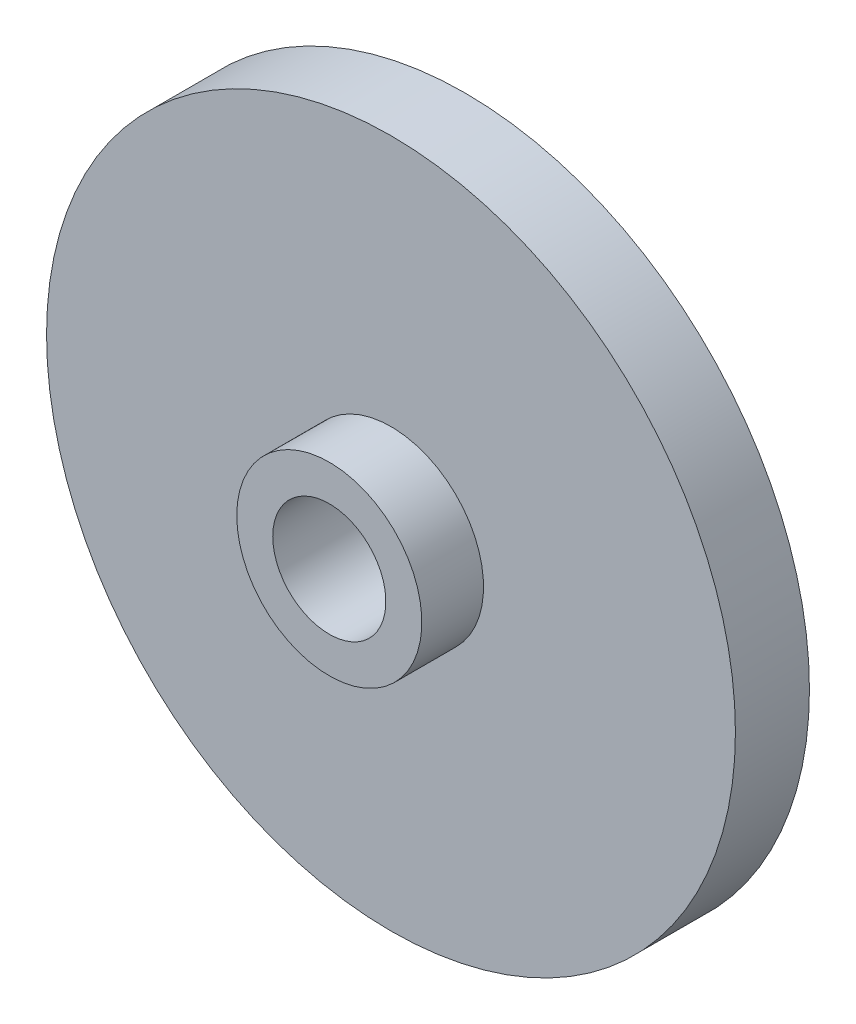
ISO-10303-21;
HEADER;
FILE_DESCRIPTION(('STEP AP214'),'2;1');
FILE_NAME('part.step','',(''),(''),'','','');
FILE_SCHEMA(('AUTOMOTIVE_DESIGN { 1 0 10303 214 1 1 1 1 }'));
ENDSEC;
DATA;
#1=APPLICATION_CONTEXT('core data for automotive mechanical design processes');
#2=APPLICATION_PROTOCOL_DEFINITION('international standard','automotive_design',2000,#1);
#3=PRODUCT_CONTEXT('',#1,'mechanical');
#4=PRODUCT('Part','Part','',(#3));
#5=PRODUCT_RELATED_PRODUCT_CATEGORY('part','',(#4));
#6=PRODUCT_DEFINITION_FORMATION('','',#4);
#7=PRODUCT_DEFINITION_CONTEXT('part definition',#1,'design');
#8=PRODUCT_DEFINITION('design','',#6,#7);
#9=PRODUCT_DEFINITION_SHAPE('','',#8);
#10=(LENGTH_UNIT() NAMED_UNIT(*) SI_UNIT(.MILLI.,.METRE.));
#11=(NAMED_UNIT(*) PLANE_ANGLE_UNIT() SI_UNIT($,.RADIAN.));
#12=(NAMED_UNIT(*) SI_UNIT($,.STERADIAN.) SOLID_ANGLE_UNIT());
#13=UNCERTAINTY_MEASURE_WITH_UNIT(LENGTH_MEASURE(1.E-05),#10,'distance_accuracy_value','');
#14=(GEOMETRIC_REPRESENTATION_CONTEXT(3) GLOBAL_UNCERTAINTY_ASSIGNED_CONTEXT((#13)) GLOBAL_UNIT_ASSIGNED_CONTEXT((#10,
#11,#12)) REPRESENTATION_CONTEXT('',''));
#15=CARTESIAN_POINT('',(0.,0.,0.));
#16=DIRECTION('',(0.,0.,1.));
#17=DIRECTION('',(1.,0.,0.));
#18=AXIS2_PLACEMENT_3D('',#15,#16,#17);
#19=CARTESIAN_POINT('',(0.,0.,6.6));
#20=DIRECTION('',(0.,0.,-1.));
#21=DIRECTION('',(-1.,0.,0.));
#22=AXIS2_PLACEMENT_3D('',#19,#20,#21);
#23=CYLINDRICAL_SURFACE('',#22,4.5);
#24=CARTESIAN_POINT('',(0.,0.,6.6));
#25=DIRECTION('',(0.,0.,-1.));
#26=DIRECTION('',(-1.,0.,0.));
#27=AXIS2_PLACEMENT_3D('',#24,#25,#26);
#28=CIRCLE('',#27,4.5);
#29=CARTESIAN_POINT('',(-4.5,0.,6.6));
#30=VERTEX_POINT('',#29);
#31=EDGE_CURVE('E10',#30,#30,#28,.T.);
#32=ORIENTED_EDGE('',*,*,#31,.T.);
#33=EDGE_LOOP('',(#32));
#34=FACE_BOUND('',#33,.T.);
#35=CARTESIAN_POINT('',(0.,0.,3.6));
#36=DIRECTION('',(0.,0.,-1.));
#37=DIRECTION('',(-1.,0.,0.));
#38=AXIS2_PLACEMENT_3D('',#35,#36,#37);
#39=CIRCLE('',#38,4.5);
#40=CARTESIAN_POINT('',(-4.5,0.,3.6));
#41=VERTEX_POINT('',#40);
#42=EDGE_CURVE('E61',#41,#41,#39,.T.);
#43=ORIENTED_EDGE('',*,*,#42,.F.);
#44=EDGE_LOOP('',(#43));
#45=FACE_BOUND('',#44,.T.);
#46=ADVANCED_FACE('F33',(#34,#45),#23,.T.);
#47=CARTESIAN_POINT('',(4.5,0.,6.6));
#48=DIRECTION('',(0.,0.,1.));
#49=DIRECTION('',(1.,0.,0.));
#50=AXIS2_PLACEMENT_3D('',#47,#48,#49);
#51=PLANE('',#50);
#52=CARTESIAN_POINT('',(0.,0.,6.6));
#53=DIRECTION('',(0.,0.,-1.));
#54=DIRECTION('',(-1.,0.,0.));
#55=AXIS2_PLACEMENT_3D('',#52,#53,#54);
#56=CIRCLE('',#55,2.75);
#57=CARTESIAN_POINT('',(-2.75,0.,6.6));
#58=VERTEX_POINT('',#57);
#59=EDGE_CURVE('E39',#58,#58,#56,.T.);
#60=ORIENTED_EDGE('',*,*,#59,.T.);
#61=EDGE_LOOP('',(#60));
#62=FACE_BOUND('',#61,.T.);
#63=ORIENTED_EDGE('',*,*,#31,.F.);
#64=EDGE_LOOP('',(#63));
#65=FACE_BOUND('',#64,.T.);
#66=ADVANCED_FACE('F69',(#62,#65),#51,.T.);
#67=CARTESIAN_POINT('',(0.,0.,6.6));
#68=DIRECTION('',(0.,0.,-1.));
#69=DIRECTION('',(-1.,0.,0.));
#70=AXIS2_PLACEMENT_3D('',#67,#68,#69);
#71=CYLINDRICAL_SURFACE('',#70,2.75);
#72=CARTESIAN_POINT('',(0.,0.,-5.5));
#73=DIRECTION('',(0.,0.,-1.));
#74=DIRECTION('',(-1.,0.,0.));
#75=AXIS2_PLACEMENT_3D('',#72,#73,#74);
#76=CIRCLE('',#75,2.75);
#77=CARTESIAN_POINT('',(-2.75,0.,-5.5));
#78=VERTEX_POINT('',#77);
#79=EDGE_CURVE('E43',#78,#78,#76,.T.);
#80=ORIENTED_EDGE('',*,*,#79,.T.);
#81=EDGE_LOOP('',(#80));
#82=FACE_BOUND('',#81,.T.);
#83=ORIENTED_EDGE('',*,*,#59,.F.);
#84=EDGE_LOOP('',(#83));
#85=FACE_BOUND('',#84,.T.);
#86=ADVANCED_FACE('F73',(#82,#85),#71,.F.);
#87=CARTESIAN_POINT('',(2.75,0.,-5.5));
#88=DIRECTION('',(0.,0.,-1.));
#89=DIRECTION('',(-1.,0.,0.));
#90=AXIS2_PLACEMENT_3D('',#87,#88,#89);
#91=PLANE('',#90);
#92=CARTESIAN_POINT('',(0.,0.,-5.5));
#93=DIRECTION('',(0.,0.,-1.));
#94=DIRECTION('',(-1.,0.,0.));
#95=AXIS2_PLACEMENT_3D('',#92,#93,#94);
#96=CIRCLE('',#95,3.5);
#97=CARTESIAN_POINT('',(-3.5,0.,-5.5));
#98=VERTEX_POINT('',#97);
#99=EDGE_CURVE('E47',#98,#98,#96,.T.);
#100=ORIENTED_EDGE('',*,*,#99,.T.);
#101=EDGE_LOOP('',(#100));
#102=FACE_BOUND('',#101,.T.);
#103=ORIENTED_EDGE('',*,*,#79,.F.);
#104=EDGE_LOOP('',(#103));
#105=FACE_BOUND('',#104,.T.);
#106=ADVANCED_FACE('F77',(#102,#105),#91,.T.);
#107=CARTESIAN_POINT('',(0.,0.,6.6));
#108=DIRECTION('',(0.,0.,-1.));
#109=DIRECTION('',(-1.,0.,0.));
#110=AXIS2_PLACEMENT_3D('',#107,#108,#109);
#111=CYLINDRICAL_SURFACE('',#110,3.5);
#112=CARTESIAN_POINT('',(0.,0.,0.));
#113=DIRECTION('',(0.,0.,-1.));
#114=DIRECTION('',(-1.,0.,0.));
#115=AXIS2_PLACEMENT_3D('',#112,#113,#114);
#116=CIRCLE('',#115,3.5);
#117=CARTESIAN_POINT('',(-3.5,0.,0.));
#118=VERTEX_POINT('',#117);
#119=EDGE_CURVE('E52',#118,#118,#116,.T.);
#120=ORIENTED_EDGE('',*,*,#119,.T.);
#121=EDGE_LOOP('',(#120));
#122=FACE_BOUND('',#121,.T.);
#123=ORIENTED_EDGE('',*,*,#99,.F.);
#124=EDGE_LOOP('',(#123));
#125=FACE_BOUND('',#124,.T.);
#126=ADVANCED_FACE('F84',(#122,#125),#111,.T.);
#127=CARTESIAN_POINT('',(3.5,0.,0.));
#128=DIRECTION('',(0.,0.,-1.));
#129=DIRECTION('',(-1.,0.,0.));
#130=AXIS2_PLACEMENT_3D('',#127,#128,#129);
#131=PLANE('',#130);
#132=CARTESIAN_POINT('',(0.,0.,0.));
#133=DIRECTION('',(0.,0.,-1.));
#134=DIRECTION('',(-1.,0.,0.));
#135=AXIS2_PLACEMENT_3D('',#132,#133,#134);
#136=CIRCLE('',#135,16.75);
#137=CARTESIAN_POINT('',(-16.75,0.,0.));
#138=VERTEX_POINT('',#137);
#139=EDGE_CURVE('E55',#138,#138,#136,.T.);
#140=ORIENTED_EDGE('',*,*,#139,.T.);
#141=EDGE_LOOP('',(#140));
#142=FACE_BOUND('',#141,.T.);
#143=ORIENTED_EDGE('',*,*,#119,.F.);
#144=EDGE_LOOP('',(#143));
#145=FACE_BOUND('',#144,.T.);
#146=ADVANCED_FACE('F88',(#142,#145),#131,.T.);
#147=CARTESIAN_POINT('',(0.,0.,6.6));
#148=DIRECTION('',(0.,0.,-1.));
#149=DIRECTION('',(-1.,0.,0.));
#150=AXIS2_PLACEMENT_3D('',#147,#148,#149);
#151=CYLINDRICAL_SURFACE('',#150,16.75);
#152=CARTESIAN_POINT('',(0.,0.,3.6));
#153=DIRECTION('',(0.,0.,-1.));
#154=DIRECTION('',(-1.,0.,0.));
#155=AXIS2_PLACEMENT_3D('',#152,#153,#154);
#156=CIRCLE('',#155,16.75);
#157=CARTESIAN_POINT('',(-16.75,0.,3.6));
#158=VERTEX_POINT('',#157);
#159=EDGE_CURVE('E58',#158,#158,#156,.T.);
#160=ORIENTED_EDGE('',*,*,#159,.T.);
#161=EDGE_LOOP('',(#160));
#162=FACE_BOUND('',#161,.T.);
#163=ORIENTED_EDGE('',*,*,#139,.F.);
#164=EDGE_LOOP('',(#163));
#165=FACE_BOUND('',#164,.T.);
#166=ADVANCED_FACE('F92',(#162,#165),#151,.T.);
#167=CARTESIAN_POINT('',(16.75,0.,3.6));
#168=DIRECTION('',(0.,0.,1.));
#169=DIRECTION('',(1.,0.,0.));
#170=AXIS2_PLACEMENT_3D('',#167,#168,#169);
#171=PLANE('',#170);
#172=ORIENTED_EDGE('',*,*,#42,.T.);
#173=EDGE_LOOP('',(#172));
#174=FACE_BOUND('',#173,.T.);
#175=ORIENTED_EDGE('',*,*,#159,.F.);
#176=EDGE_LOOP('',(#175));
#177=FACE_BOUND('',#176,.T.);
#178=ADVANCED_FACE('F65',(#174,#177),#171,.T.);
#179=CLOSED_SHELL('',(#46,#66,#86,#106,#126,#146,#166,#178));
#180=MANIFOLD_SOLID_BREP('B2',#179);
#181=ADVANCED_BREP_SHAPE_REPRESENTATION('',(#18,#180),#14);
#182=SHAPE_DEFINITION_REPRESENTATION(#9,#181);
ENDSEC;
END-ISO-10303-21;
